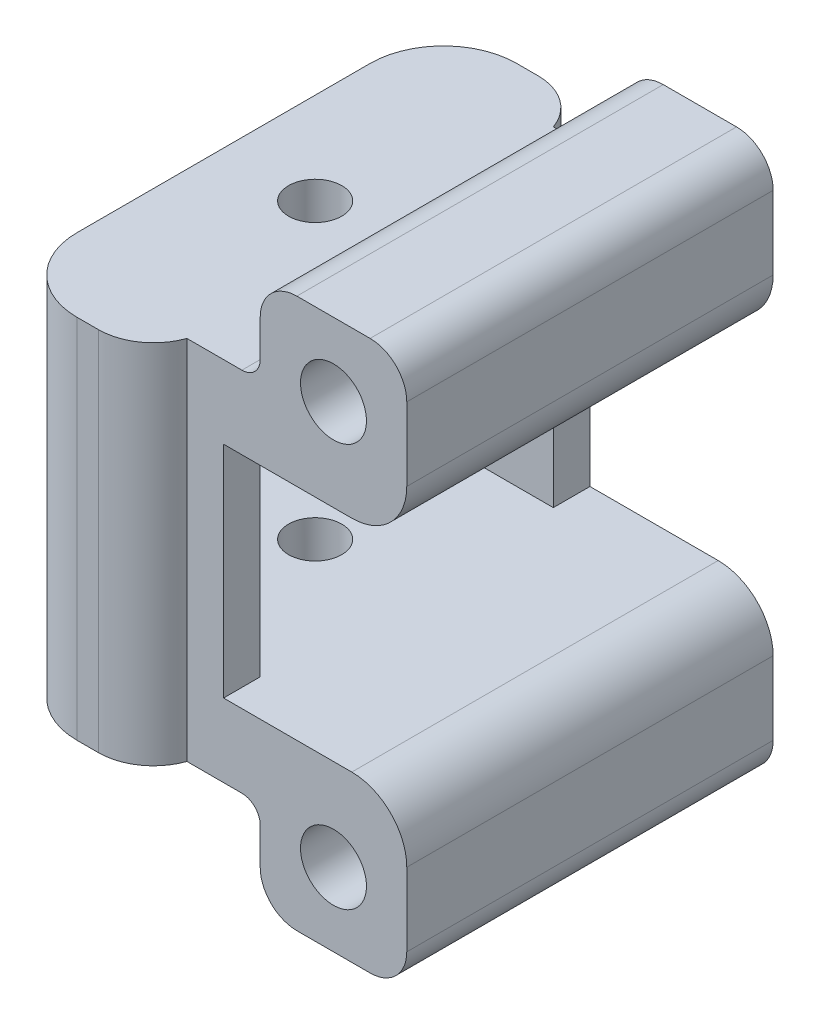
ISO-10303-21;
HEADER;
FILE_DESCRIPTION(('STEP AP214'),'2;1');
FILE_NAME('part.step','',(''),(''),'','','');
FILE_SCHEMA(('AUTOMOTIVE_DESIGN { 1 0 10303 214 1 1 1 1 }'));
ENDSEC;
DATA;
#1=APPLICATION_CONTEXT('core data for automotive mechanical design processes');
#2=APPLICATION_PROTOCOL_DEFINITION('international standard','automotive_design',2000,#1);
#3=PRODUCT_CONTEXT('',#1,'mechanical');
#4=PRODUCT('Part','Part','',(#3));
#5=PRODUCT_RELATED_PRODUCT_CATEGORY('part','',(#4));
#6=PRODUCT_DEFINITION_FORMATION('','',#4);
#7=PRODUCT_DEFINITION_CONTEXT('part definition',#1,'design');
#8=PRODUCT_DEFINITION('design','',#6,#7);
#9=PRODUCT_DEFINITION_SHAPE('','',#8);
#10=(LENGTH_UNIT() NAMED_UNIT(*) SI_UNIT(.MILLI.,.METRE.));
#11=(NAMED_UNIT(*) PLANE_ANGLE_UNIT() SI_UNIT($,.RADIAN.));
#12=(NAMED_UNIT(*) SI_UNIT($,.STERADIAN.) SOLID_ANGLE_UNIT());
#13=UNCERTAINTY_MEASURE_WITH_UNIT(LENGTH_MEASURE(1.E-05),#10,'distance_accuracy_value','');
#14=(GEOMETRIC_REPRESENTATION_CONTEXT(3) GLOBAL_UNCERTAINTY_ASSIGNED_CONTEXT((#13)) GLOBAL_UNIT_ASSIGNED_CONTEXT((#10,
#11,#12)) REPRESENTATION_CONTEXT('',''));
#15=CARTESIAN_POINT('',(0.,0.,0.));
#16=DIRECTION('',(0.,0.,1.));
#17=DIRECTION('',(1.,0.,0.));
#18=AXIS2_PLACEMENT_3D('',#15,#16,#17);
#19=CARTESIAN_POINT('',(6.,0.,0.));
#20=DIRECTION('',(1.,0.,0.));
#21=DIRECTION('',(0.,0.,-1.));
#22=AXIS2_PLACEMENT_3D('',#19,#20,#21);
#23=PLANE('',#22);
#24=DIRECTION('',(0.,0.,1.));
#25=VECTOR('',#24,1.);
#26=CARTESIAN_POINT('',(6.,0.,0.));
#27=LINE('',#26,#25);
#28=CARTESIAN_POINT('',(6.,0.,2.));
#29=VERTEX_POINT('',#28);
#30=CARTESIAN_POINT('',(6.,0.,18.));
#31=VERTEX_POINT('',#30);
#32=EDGE_CURVE('E235',#29,#31,#27,.T.);
#33=ORIENTED_EDGE('',*,*,#32,.F.);
#34=DIRECTION('',(0.,1.,0.));
#35=VECTOR('',#34,1.);
#36=CARTESIAN_POINT('',(6.,-20.,2.));
#37=LINE('',#36,#35);
#38=CARTESIAN_POINT('',(6.,-4.00000000000002,2.));
#39=VERTEX_POINT('',#38);
#40=EDGE_CURVE('E230',#29,#39,#37,.F.);
#41=ORIENTED_EDGE('',*,*,#40,.T.);
#42=DIRECTION('',(0.,0.,-1.));
#43=VECTOR('',#42,1.);
#44=CARTESIAN_POINT('',(6.,-4.,0.));
#45=LINE('',#44,#43);
#46=CARTESIAN_POINT('',(6.,-4.00000000000001,18.));
#47=VERTEX_POINT('',#46);
#48=EDGE_CURVE('E232',#47,#39,#45,.T.);
#49=ORIENTED_EDGE('',*,*,#48,.F.);
#50=DIRECTION('',(0.,-1.,0.));
#51=VECTOR('',#50,1.);
#52=CARTESIAN_POINT('',(6.,0.,18.));
#53=LINE('',#52,#51);
#54=EDGE_CURVE('E453',#47,#31,#53,.F.);
#55=ORIENTED_EDGE('',*,*,#54,.T.);
#56=EDGE_LOOP('',(#33,#41,#49,#55));
#57=FACE_BOUND('',#56,.T.);
#58=ADVANCED_FACE('F35',(#57),#23,.F.);
#59=CARTESIAN_POINT('',(4.,0.,0.));
#60=DIRECTION('',(0.,0.,1.));
#61=DIRECTION('',(0.,-1.,0.));
#62=AXIS2_PLACEMENT_3D('',#59,#60,#61);
#63=PLANE('',#62);
#64=CARTESIAN_POINT('',(22.,1.,0.));
#65=DIRECTION('',(0.,0.,-1.));
#66=DIRECTION('',(0.,1.,0.));
#67=AXIS2_PLACEMENT_3D('',#64,#65,#66);
#68=CIRCLE('',#67,1.8);
#69=CARTESIAN_POINT('',(22.,2.8,0.));
#70=VERTEX_POINT('',#69);
#71=EDGE_CURVE('E316',#70,#70,#68,.T.);
#72=ORIENTED_EDGE('',*,*,#71,.F.);
#73=EDGE_LOOP('',(#72));
#74=FACE_BOUND('',#73,.T.);
#75=CARTESIAN_POINT('',(21.9999999999991,-21.,0.));
#76=DIRECTION('',(0.,0.,-1.));
#77=DIRECTION('',(0.,1.,0.));
#78=AXIS2_PLACEMENT_3D('',#75,#76,#77);
#79=CIRCLE('',#78,1.8);
#80=CARTESIAN_POINT('',(21.9999999999991,-19.2,0.));
#81=VERTEX_POINT('',#80);
#82=EDGE_CURVE('E312',#81,#81,#79,.T.);
#83=ORIENTED_EDGE('',*,*,#82,.F.);
#84=EDGE_LOOP('',(#83));
#85=FACE_BOUND('',#84,.T.);
#86=DIRECTION('',(1.,0.,0.));
#87=VECTOR('',#86,1.);
#88=CARTESIAN_POINT('',(26.,-25.,0.));
#89=LINE('',#88,#87);
#90=CARTESIAN_POINT('',(20.,-25.,0.));
#91=VERTEX_POINT('',#90);
#92=CARTESIAN_POINT('',(24.,-25.,0.));
#93=VERTEX_POINT('',#92);
#94=EDGE_CURVE('E338',#91,#93,#89,.T.);
#95=ORIENTED_EDGE('',*,*,#94,.F.);
#96=CARTESIAN_POINT('',(20.,-23.,0.));
#97=DIRECTION('',(0.,0.,1.));
#98=DIRECTION('',(0.,-1.,0.));
#99=AXIS2_PLACEMENT_3D('',#96,#97,#98);
#100=CIRCLE('',#99,2.);
#101=CARTESIAN_POINT('',(18.,-23.,0.));
#102=VERTEX_POINT('',#101);
#103=EDGE_CURVE('E421',#91,#102,#100,.F.);
#104=ORIENTED_EDGE('',*,*,#103,.T.);
#105=DIRECTION('',(0.,1.,0.));
#106=VECTOR('',#105,1.);
#107=CARTESIAN_POINT('',(18.,-25.,0.));
#108=LINE('',#107,#106);
#109=CARTESIAN_POINT('',(18.,-21.,0.));
#110=VERTEX_POINT('',#109);
#111=EDGE_CURVE('E341',#102,#110,#108,.T.);
#112=ORIENTED_EDGE('',*,*,#111,.T.);
#113=CARTESIAN_POINT('',(17.,-21.,0.));
#114=DIRECTION('',(0.,0.,1.));
#115=DIRECTION('',(0.,-1.,0.));
#116=AXIS2_PLACEMENT_3D('',#113,#114,#115);
#117=CIRCLE('',#116,1.);
#118=CARTESIAN_POINT('',(17.,-20.,0.));
#119=VERTEX_POINT('',#118);
#120=EDGE_CURVE('E486',#110,#119,#117,.T.);
#121=ORIENTED_EDGE('',*,*,#120,.T.);
#122=DIRECTION('',(-1.,0.,0.));
#123=VECTOR('',#122,1.);
#124=CARTESIAN_POINT('',(4.,-20.,0.));
#125=LINE('',#124,#123);
#126=CARTESIAN_POINT('',(14.,-20.,0.));
#127=VERTEX_POINT('',#126);
#128=EDGE_CURVE('E377',#119,#127,#125,.T.);
#129=ORIENTED_EDGE('',*,*,#128,.T.);
#130=DIRECTION('',(0.,-1.,0.));
#131=VECTOR('',#130,1.);
#132=CARTESIAN_POINT('',(14.,-20.,0.));
#133=LINE('',#132,#131);
#134=CARTESIAN_POINT('',(14.,0.,0.));
#135=VERTEX_POINT('',#134);
#136=EDGE_CURVE('E280',#135,#127,#133,.T.);
#137=ORIENTED_EDGE('',*,*,#136,.F.);
#138=DIRECTION('',(-1.,0.,0.));
#139=VECTOR('',#138,1.);
#140=CARTESIAN_POINT('',(4.,0.,0.));
#141=LINE('',#140,#139);
#142=CARTESIAN_POINT('',(17.,0.,0.));
#143=VERTEX_POINT('',#142);
#144=EDGE_CURVE('E383',#143,#135,#141,.T.);
#145=ORIENTED_EDGE('',*,*,#144,.F.);
#146=CARTESIAN_POINT('',(17.,1.,0.));
#147=DIRECTION('',(0.,0.,1.));
#148=DIRECTION('',(0.,-1.,0.));
#149=AXIS2_PLACEMENT_3D('',#146,#147,#148);
#150=CIRCLE('',#149,1.);
#151=CARTESIAN_POINT('',(18.,1.,0.));
#152=VERTEX_POINT('',#151);
#153=EDGE_CURVE('E11',#143,#152,#150,.T.);
#154=ORIENTED_EDGE('',*,*,#153,.T.);
#155=DIRECTION('',(0.,-1.,0.));
#156=VECTOR('',#155,1.);
#157=CARTESIAN_POINT('',(18.,5.,0.));
#158=LINE('',#157,#156);
#159=CARTESIAN_POINT('',(18.,3.,0.));
#160=VERTEX_POINT('',#159);
#161=EDGE_CURVE('E332',#160,#152,#158,.T.);
#162=ORIENTED_EDGE('',*,*,#161,.F.);
#163=CARTESIAN_POINT('',(20.,3.,0.));
#164=DIRECTION('',(0.,0.,1.));
#165=DIRECTION('',(0.,-1.,0.));
#166=AXIS2_PLACEMENT_3D('',#163,#164,#165);
#167=CIRCLE('',#166,2.);
#168=CARTESIAN_POINT('',(20.,5.,0.));
#169=VERTEX_POINT('',#168);
#170=EDGE_CURVE('E417',#160,#169,#167,.F.);
#171=ORIENTED_EDGE('',*,*,#170,.T.);
#172=DIRECTION('',(-1.,0.,0.));
#173=VECTOR('',#172,1.);
#174=CARTESIAN_POINT('',(26.,5.,0.));
#175=LINE('',#174,#173);
#176=CARTESIAN_POINT('',(24.,5.,0.));
#177=VERTEX_POINT('',#176);
#178=EDGE_CURVE('E322',#177,#169,#175,.T.);
#179=ORIENTED_EDGE('',*,*,#178,.F.);
#180=CARTESIAN_POINT('',(24.,3.,0.));
#181=DIRECTION('',(0.,0.,1.));
#182=DIRECTION('',(0.,-1.,0.));
#183=AXIS2_PLACEMENT_3D('',#180,#181,#182);
#184=CIRCLE('',#183,2.);
#185=CARTESIAN_POINT('',(26.,3.,0.));
#186=VERTEX_POINT('',#185);
#187=EDGE_CURVE('E415',#177,#186,#184,.F.);
#188=ORIENTED_EDGE('',*,*,#187,.T.);
#189=DIRECTION('',(0.,1.,0.));
#190=VECTOR('',#189,1.);
#191=CARTESIAN_POINT('',(26.,0.,0.));
#192=LINE('',#191,#190);
#193=CARTESIAN_POINT('',(26.,-1.,0.));
#194=VERTEX_POINT('',#193);
#195=EDGE_CURVE('E348',#194,#186,#192,.T.);
#196=ORIENTED_EDGE('',*,*,#195,.F.);
#197=CARTESIAN_POINT('',(23.,-1.,0.));
#198=DIRECTION('',(0.,0.,1.));
#199=DIRECTION('',(0.,-1.,0.));
#200=AXIS2_PLACEMENT_3D('',#197,#198,#199);
#201=CIRCLE('',#200,3.);
#202=CARTESIAN_POINT('',(23.,-4.,0.));
#203=VERTEX_POINT('',#202);
#204=EDGE_CURVE('E399',#194,#203,#201,.F.);
#205=ORIENTED_EDGE('',*,*,#204,.T.);
#206=DIRECTION('',(-1.,0.,0.));
#207=VECTOR('',#206,1.);
#208=CARTESIAN_POINT('',(26.,-4.,0.));
#209=LINE('',#208,#207);
#210=CARTESIAN_POINT('',(16.,-4.,0.));
#211=VERTEX_POINT('',#210);
#212=EDGE_CURVE('E353',#203,#211,#209,.T.);
#213=ORIENTED_EDGE('',*,*,#212,.T.);
#214=DIRECTION('',(0.,1.,0.));
#215=VECTOR('',#214,1.);
#216=CARTESIAN_POINT('',(16.,0.,0.));
#217=LINE('',#216,#215);
#218=CARTESIAN_POINT('',(16.,-16.,0.));
#219=VERTEX_POINT('',#218);
#220=EDGE_CURVE('E371',#219,#211,#217,.T.);
#221=ORIENTED_EDGE('',*,*,#220,.F.);
#222=DIRECTION('',(-1.,0.,0.));
#223=VECTOR('',#222,1.);
#224=CARTESIAN_POINT('',(26.,-16.,0.));
#225=LINE('',#224,#223);
#226=CARTESIAN_POINT('',(23.,-16.,0.));
#227=VERTEX_POINT('',#226);
#228=EDGE_CURVE('E369',#227,#219,#225,.T.);
#229=ORIENTED_EDGE('',*,*,#228,.F.);
#230=CARTESIAN_POINT('',(23.,-19.,0.));
#231=DIRECTION('',(0.,0.,1.));
#232=DIRECTION('',(0.,-1.,0.));
#233=AXIS2_PLACEMENT_3D('',#230,#231,#232);
#234=CIRCLE('',#233,3.);
#235=CARTESIAN_POINT('',(26.,-19.,0.));
#236=VERTEX_POINT('',#235);
#237=EDGE_CURVE('E401',#227,#236,#234,.F.);
#238=ORIENTED_EDGE('',*,*,#237,.T.);
#239=DIRECTION('',(0.,1.,0.));
#240=VECTOR('',#239,1.);
#241=CARTESIAN_POINT('',(26.,-20.,0.));
#242=LINE('',#241,#240);
#243=CARTESIAN_POINT('',(26.,-23.,0.));
#244=VERTEX_POINT('',#243);
#245=EDGE_CURVE('E359',#244,#236,#242,.T.);
#246=ORIENTED_EDGE('',*,*,#245,.F.);
#247=CARTESIAN_POINT('',(24.,-23.,0.));
#248=DIRECTION('',(0.,0.,1.));
#249=DIRECTION('',(0.,-1.,0.));
#250=AXIS2_PLACEMENT_3D('',#247,#248,#249);
#251=CIRCLE('',#250,2.);
#252=EDGE_CURVE('E419',#244,#93,#251,.F.);
#253=ORIENTED_EDGE('',*,*,#252,.T.);
#254=EDGE_LOOP('',(#95,#104,#112,#121,#129,#137,#145,#154,#162,#171,#179,#188,#196,#205,#213,
#221,#229,#238,#246,#253));
#255=FACE_BOUND('',#254,.T.);
#256=ADVANCED_FACE('F514',(#74,#85,#255),#63,.F.);
#257=CARTESIAN_POINT('',(4.,0.,20.));
#258=DIRECTION('',(0.,0.,-1.));
#259=DIRECTION('',(-1.,0.,0.));
#260=AXIS2_PLACEMENT_3D('',#257,#258,#259);
#261=PLANE('',#260);
#262=CARTESIAN_POINT('',(22.,1.,20.));
#263=DIRECTION('',(0.,0.,-1.));
#264=DIRECTION('',(0.,1.,0.));
#265=AXIS2_PLACEMENT_3D('',#262,#263,#264);
#266=CIRCLE('',#265,1.8);
#267=CARTESIAN_POINT('',(22.,2.8,20.));
#268=VERTEX_POINT('',#267);
#269=EDGE_CURVE('E319',#268,#268,#266,.T.);
#270=ORIENTED_EDGE('',*,*,#269,.T.);
#271=EDGE_LOOP('',(#270));
#272=FACE_BOUND('',#271,.T.);
#273=CARTESIAN_POINT('',(21.9999999999991,-21.,20.));
#274=DIRECTION('',(0.,0.,-1.));
#275=DIRECTION('',(0.,1.,0.));
#276=AXIS2_PLACEMENT_3D('',#273,#274,#275);
#277=CIRCLE('',#276,1.8);
#278=CARTESIAN_POINT('',(21.9999999999991,-19.2,20.));
#279=VERTEX_POINT('',#278);
#280=EDGE_CURVE('E313',#279,#279,#277,.T.);
#281=ORIENTED_EDGE('',*,*,#280,.T.);
#282=EDGE_LOOP('',(#281));
#283=FACE_BOUND('',#282,.T.);
#284=DIRECTION('',(0.,1.,0.));
#285=VECTOR('',#284,1.);
#286=CARTESIAN_POINT('',(18.,-25.,20.));
#287=LINE('',#286,#285);
#288=CARTESIAN_POINT('',(18.,-23.,20.));
#289=VERTEX_POINT('',#288);
#290=CARTESIAN_POINT('',(18.,-21.,20.));
#291=VERTEX_POINT('',#290);
#292=EDGE_CURVE('E344',#289,#291,#287,.T.);
#293=ORIENTED_EDGE('',*,*,#292,.F.);
#294=CARTESIAN_POINT('',(20.,-23.,20.));
#295=DIRECTION('',(0.,0.,-1.));
#296=DIRECTION('',(-1.,0.,0.));
#297=AXIS2_PLACEMENT_3D('',#294,#295,#296);
#298=CIRCLE('',#297,2.);
#299=CARTESIAN_POINT('',(20.,-25.,20.));
#300=VERTEX_POINT('',#299);
#301=EDGE_CURVE('E431',#289,#300,#298,.F.);
#302=ORIENTED_EDGE('',*,*,#301,.T.);
#303=DIRECTION('',(-1.,0.,0.));
#304=VECTOR('',#303,1.);
#305=CARTESIAN_POINT('',(26.,-25.,20.));
#306=LINE('',#305,#304);
#307=CARTESIAN_POINT('',(24.,-25.,20.));
#308=VERTEX_POINT('',#307);
#309=EDGE_CURVE('E335',#308,#300,#306,.T.);
#310=ORIENTED_EDGE('',*,*,#309,.F.);
#311=CARTESIAN_POINT('',(24.,-23.,20.));
#312=DIRECTION('',(0.,0.,-1.));
#313=DIRECTION('',(-1.,0.,0.));
#314=AXIS2_PLACEMENT_3D('',#311,#312,#313);
#315=CIRCLE('',#314,2.);
#316=CARTESIAN_POINT('',(26.,-23.,20.));
#317=VERTEX_POINT('',#316);
#318=EDGE_CURVE('E429',#308,#317,#315,.F.);
#319=ORIENTED_EDGE('',*,*,#318,.T.);
#320=DIRECTION('',(0.,-1.,0.));
#321=VECTOR('',#320,1.);
#322=CARTESIAN_POINT('',(26.,-20.,20.));
#323=LINE('',#322,#321);
#324=CARTESIAN_POINT('',(26.,-19.,20.));
#325=VERTEX_POINT('',#324);
#326=EDGE_CURVE('E361',#325,#317,#323,.T.);
#327=ORIENTED_EDGE('',*,*,#326,.F.);
#328=CARTESIAN_POINT('',(23.,-19.,20.));
#329=DIRECTION('',(0.,0.,-1.));
#330=DIRECTION('',(-1.,0.,0.));
#331=AXIS2_PLACEMENT_3D('',#328,#329,#330);
#332=CIRCLE('',#331,3.);
#333=CARTESIAN_POINT('',(23.,-16.,20.));
#334=VERTEX_POINT('',#333);
#335=EDGE_CURVE('E395',#325,#334,#332,.F.);
#336=ORIENTED_EDGE('',*,*,#335,.T.);
#337=DIRECTION('',(-1.,0.,0.));
#338=VECTOR('',#337,1.);
#339=CARTESIAN_POINT('',(26.,-16.,20.));
#340=LINE('',#339,#338);
#341=CARTESIAN_POINT('',(16.,-16.,20.));
#342=VERTEX_POINT('',#341);
#343=EDGE_CURVE('E364',#334,#342,#340,.T.);
#344=ORIENTED_EDGE('',*,*,#343,.T.);
#345=DIRECTION('',(0.,-1.,0.));
#346=VECTOR('',#345,1.);
#347=CARTESIAN_POINT('',(16.,0.,20.));
#348=LINE('',#347,#346);
#349=CARTESIAN_POINT('',(16.,-4.,20.));
#350=VERTEX_POINT('',#349);
#351=EDGE_CURVE('E374',#350,#342,#348,.T.);
#352=ORIENTED_EDGE('',*,*,#351,.F.);
#353=DIRECTION('',(-1.,0.,0.));
#354=VECTOR('',#353,1.);
#355=CARTESIAN_POINT('',(26.,-4.,20.));
#356=LINE('',#355,#354);
#357=CARTESIAN_POINT('',(23.,-4.,20.));
#358=VERTEX_POINT('',#357);
#359=EDGE_CURVE('E356',#358,#350,#356,.T.);
#360=ORIENTED_EDGE('',*,*,#359,.F.);
#361=CARTESIAN_POINT('',(23.,-1.,20.));
#362=DIRECTION('',(0.,0.,-1.));
#363=DIRECTION('',(-1.,0.,0.));
#364=AXIS2_PLACEMENT_3D('',#361,#362,#363);
#365=CIRCLE('',#364,3.);
#366=CARTESIAN_POINT('',(26.,-1.,20.));
#367=VERTEX_POINT('',#366);
#368=EDGE_CURVE('E392',#358,#367,#365,.F.);
#369=ORIENTED_EDGE('',*,*,#368,.T.);
#370=DIRECTION('',(0.,-1.,0.));
#371=VECTOR('',#370,1.);
#372=CARTESIAN_POINT('',(26.,0.,20.));
#373=LINE('',#372,#371);
#374=CARTESIAN_POINT('',(26.,3.,20.));
#375=VERTEX_POINT('',#374);
#376=EDGE_CURVE('E351',#375,#367,#373,.T.);
#377=ORIENTED_EDGE('',*,*,#376,.F.);
#378=CARTESIAN_POINT('',(24.,3.,20.));
#379=DIRECTION('',(0.,0.,-1.));
#380=DIRECTION('',(-1.,0.,0.));
#381=AXIS2_PLACEMENT_3D('',#378,#379,#380);
#382=CIRCLE('',#381,2.);
#383=CARTESIAN_POINT('',(24.,5.,20.));
#384=VERTEX_POINT('',#383);
#385=EDGE_CURVE('E425',#375,#384,#382,.F.);
#386=ORIENTED_EDGE('',*,*,#385,.T.);
#387=DIRECTION('',(1.,0.,0.));
#388=VECTOR('',#387,1.);
#389=CARTESIAN_POINT('',(26.,5.,20.));
#390=LINE('',#389,#388);
#391=CARTESIAN_POINT('',(20.,5.,20.));
#392=VERTEX_POINT('',#391);
#393=EDGE_CURVE('E327',#392,#384,#390,.T.);
#394=ORIENTED_EDGE('',*,*,#393,.F.);
#395=CARTESIAN_POINT('',(20.,3.,20.));
#396=DIRECTION('',(0.,0.,-1.));
#397=DIRECTION('',(-1.,0.,0.));
#398=AXIS2_PLACEMENT_3D('',#395,#396,#397);
#399=CIRCLE('',#398,2.);
#400=CARTESIAN_POINT('',(18.,3.,20.));
#401=VERTEX_POINT('',#400);
#402=EDGE_CURVE('E427',#392,#401,#399,.F.);
#403=ORIENTED_EDGE('',*,*,#402,.T.);
#404=DIRECTION('',(0.,-1.,0.));
#405=VECTOR('',#404,1.);
#406=CARTESIAN_POINT('',(18.,5.,20.));
#407=LINE('',#406,#405);
#408=CARTESIAN_POINT('',(18.,0.999999999999997,20.));
#409=VERTEX_POINT('',#408);
#410=EDGE_CURVE('E330',#401,#409,#407,.T.);
#411=ORIENTED_EDGE('',*,*,#410,.T.);
#412=CARTESIAN_POINT('',(17.,0.999999999999996,20.));
#413=DIRECTION('',(0.,0.,-1.));
#414=DIRECTION('',(-1.,0.,0.));
#415=AXIS2_PLACEMENT_3D('',#412,#413,#414);
#416=CIRCLE('',#415,1.);
#417=CARTESIAN_POINT('',(17.,0.,20.));
#418=VERTEX_POINT('',#417);
#419=EDGE_CURVE('E43',#409,#418,#416,.T.);
#420=ORIENTED_EDGE('',*,*,#419,.T.);
#421=DIRECTION('',(-1.,0.,0.));
#422=VECTOR('',#421,1.);
#423=CARTESIAN_POINT('',(4.,0.,20.));
#424=LINE('',#423,#422);
#425=CARTESIAN_POINT('',(14.,0.,20.));
#426=VERTEX_POINT('',#425);
#427=EDGE_CURVE('E381',#418,#426,#424,.T.);
#428=ORIENTED_EDGE('',*,*,#427,.T.);
#429=DIRECTION('',(0.,1.,0.));
#430=VECTOR('',#429,1.);
#431=CARTESIAN_POINT('',(14.,-20.,20.));
#432=LINE('',#431,#430);
#433=CARTESIAN_POINT('',(14.,-20.,20.));
#434=VERTEX_POINT('',#433);
#435=EDGE_CURVE('E286',#434,#426,#432,.T.);
#436=ORIENTED_EDGE('',*,*,#435,.F.);
#437=DIRECTION('',(-1.,0.,0.));
#438=VECTOR('',#437,1.);
#439=CARTESIAN_POINT('',(4.,-20.,20.));
#440=LINE('',#439,#438);
#441=CARTESIAN_POINT('',(17.,-20.,20.));
#442=VERTEX_POINT('',#441);
#443=EDGE_CURVE('E379',#442,#434,#440,.T.);
#444=ORIENTED_EDGE('',*,*,#443,.F.);
#445=CARTESIAN_POINT('',(17.,-21.,20.));
#446=DIRECTION('',(0.,0.,-1.));
#447=DIRECTION('',(-1.,0.,0.));
#448=AXIS2_PLACEMENT_3D('',#445,#446,#447);
#449=CIRCLE('',#448,1.);
#450=EDGE_CURVE('E488',#442,#291,#449,.T.);
#451=ORIENTED_EDGE('',*,*,#450,.T.);
#452=EDGE_LOOP('',(#293,#302,#310,#319,#327,#336,#344,#352,#360,#369,#377,#386,#394,#403,#411,
#420,#428,#436,#444,#451));
#453=FACE_BOUND('',#452,.T.);
#454=ADVANCED_FACE('F502',(#272,#283,#453),#261,.F.);
#455=CARTESIAN_POINT('',(4.,0.,0.));
#456=DIRECTION('',(0.,-1.,0.));
#457=DIRECTION('',(0.,0.,-1.));
#458=AXIS2_PLACEMENT_3D('',#455,#456,#457);
#459=PLANE('',#458);
#460=CARTESIAN_POINT('',(11.,0.,10.));
#461=DIRECTION('',(0.,1.,0.));
#462=DIRECTION('',(0.,0.,1.));
#463=AXIS2_PLACEMENT_3D('',#460,#461,#462);
#464=CIRCLE('',#463,1.45);
#465=CARTESIAN_POINT('',(11.,0.,11.45));
#466=VERTEX_POINT('',#465);
#467=EDGE_CURVE('E294',#466,#466,#464,.T.);
#468=ORIENTED_EDGE('',*,*,#467,.F.);
#469=EDGE_LOOP('',(#468));
#470=FACE_BOUND('',#469,.T.);
#471=ORIENTED_EDGE('',*,*,#427,.F.);
#472=DIRECTION('',(0.,0.,1.));
#473=VECTOR('',#472,1.);
#474=CARTESIAN_POINT('',(17.,0.,0.));
#475=LINE('',#474,#473);
#476=EDGE_CURVE('E56',#418,#143,#475,.F.);
#477=ORIENTED_EDGE('',*,*,#476,.T.);
#478=ORIENTED_EDGE('',*,*,#144,.T.);
#479=CARTESIAN_POINT('',(11.1715728752538,0.,1.));
#480=DIRECTION('',(0.,-1.,0.));
#481=DIRECTION('',(0.,0.,-1.));
#482=AXIS2_PLACEMENT_3D('',#479,#480,#481);
#483=CIRCLE('',#482,3.);
#484=CARTESIAN_POINT('',(11.1715728752538,0.,-2.));
#485=VERTEX_POINT('',#484);
#486=EDGE_CURVE('E476',#135,#485,#483,.F.);
#487=ORIENTED_EDGE('',*,*,#486,.T.);
#488=DIRECTION('',(1.,0.,0.));
#489=VECTOR('',#488,1.);
#490=CARTESIAN_POINT('',(6.,0.,-2.));
#491=LINE('',#490,#489);
#492=CARTESIAN_POINT('',(10.,0.,-2.));
#493=VERTEX_POINT('',#492);
#494=EDGE_CURVE('E281',#493,#485,#491,.T.);
#495=ORIENTED_EDGE('',*,*,#494,.F.);
#496=CARTESIAN_POINT('',(10.,0.,2.));
#497=DIRECTION('',(0.,-1.,0.));
#498=DIRECTION('',(0.,0.,-1.));
#499=AXIS2_PLACEMENT_3D('',#496,#497,#498);
#500=CIRCLE('',#499,4.);
#501=EDGE_CURVE('E451',#493,#29,#500,.F.);
#502=ORIENTED_EDGE('',*,*,#501,.T.);
#503=ORIENTED_EDGE('',*,*,#32,.T.);
#504=CARTESIAN_POINT('',(10.,0.,18.));
#505=DIRECTION('',(0.,-1.,0.));
#506=DIRECTION('',(0.,0.,-1.));
#507=AXIS2_PLACEMENT_3D('',#504,#505,#506);
#508=CIRCLE('',#507,4.);
#509=CARTESIAN_POINT('',(10.,0.,22.));
#510=VERTEX_POINT('',#509);
#511=EDGE_CURVE('E448',#31,#510,#508,.F.);
#512=ORIENTED_EDGE('',*,*,#511,.T.);
#513=DIRECTION('',(-1.,0.,0.));
#514=VECTOR('',#513,1.);
#515=CARTESIAN_POINT('',(6.,0.,22.));
#516=LINE('',#515,#514);
#517=CARTESIAN_POINT('',(11.1715728752538,0.,22.));
#518=VERTEX_POINT('',#517);
#519=EDGE_CURVE('E292',#518,#510,#516,.T.);
#520=ORIENTED_EDGE('',*,*,#519,.F.);
#521=CARTESIAN_POINT('',(11.1715728752538,0.,19.));
#522=DIRECTION('',(0.,-1.,0.));
#523=DIRECTION('',(0.,0.,-1.));
#524=AXIS2_PLACEMENT_3D('',#521,#522,#523);
#525=CIRCLE('',#524,3.);
#526=EDGE_CURVE('E473',#518,#426,#525,.F.);
#527=ORIENTED_EDGE('',*,*,#526,.T.);
#528=EDGE_LOOP('',(#471,#477,#478,#487,#495,#502,#503,#512,#520,#527));
#529=FACE_BOUND('',#528,.T.);
#530=ADVANCED_FACE('F613',(#470,#529),#459,.F.);
#531=CARTESIAN_POINT('',(4.,-20.,0.));
#532=DIRECTION('',(0.,1.,0.));
#533=DIRECTION('',(0.,0.,1.));
#534=AXIS2_PLACEMENT_3D('',#531,#532,#533);
#535=PLANE('',#534);
#536=CARTESIAN_POINT('',(11.,-20.,10.));
#537=DIRECTION('',(0.,1.,0.));
#538=DIRECTION('',(0.,0.,1.));
#539=AXIS2_PLACEMENT_3D('',#536,#537,#538);
#540=CIRCLE('',#539,1.45);
#541=CARTESIAN_POINT('',(11.,-20.,11.45));
#542=VERTEX_POINT('',#541);
#543=EDGE_CURVE('E303',#542,#542,#540,.T.);
#544=ORIENTED_EDGE('',*,*,#543,.T.);
#545=EDGE_LOOP('',(#544));
#546=FACE_BOUND('',#545,.T.);
#547=ORIENTED_EDGE('',*,*,#128,.F.);
#548=DIRECTION('',(0.,0.,-1.));
#549=VECTOR('',#548,1.);
#550=CARTESIAN_POINT('',(17.,-20.,20.));
#551=LINE('',#550,#549);
#552=EDGE_CURVE('E484',#119,#442,#551,.F.);
#553=ORIENTED_EDGE('',*,*,#552,.T.);
#554=ORIENTED_EDGE('',*,*,#443,.T.);
#555=CARTESIAN_POINT('',(11.1715728752538,-20.,19.));
#556=DIRECTION('',(0.,1.,0.));
#557=DIRECTION('',(0.,0.,1.));
#558=AXIS2_PLACEMENT_3D('',#555,#556,#557);
#559=CIRCLE('',#558,3.);
#560=CARTESIAN_POINT('',(11.1715728752538,-20.,22.));
#561=VERTEX_POINT('',#560);
#562=EDGE_CURVE('E468',#434,#561,#559,.F.);
#563=ORIENTED_EDGE('',*,*,#562,.T.);
#564=DIRECTION('',(1.,0.,0.));
#565=VECTOR('',#564,1.);
#566=CARTESIAN_POINT('',(6.,-20.,22.));
#567=LINE('',#566,#565);
#568=CARTESIAN_POINT('',(10.,-20.,22.));
#569=VERTEX_POINT('',#568);
#570=EDGE_CURVE('E289',#569,#561,#567,.T.);
#571=ORIENTED_EDGE('',*,*,#570,.F.);
#572=CARTESIAN_POINT('',(10.,-20.,18.));
#573=DIRECTION('',(0.,1.,0.));
#574=DIRECTION('',(0.,0.,1.));
#575=AXIS2_PLACEMENT_3D('',#572,#573,#574);
#576=CIRCLE('',#575,4.);
#577=CARTESIAN_POINT('',(6.,-20.,18.));
#578=VERTEX_POINT('',#577);
#579=EDGE_CURVE('E238',#569,#578,#576,.F.);
#580=ORIENTED_EDGE('',*,*,#579,.T.);
#581=DIRECTION('',(0.,0.,1.));
#582=VECTOR('',#581,1.);
#583=CARTESIAN_POINT('',(6.,-20.,0.));
#584=LINE('',#583,#582);
#585=CARTESIAN_POINT('',(6.,-20.,2.));
#586=VERTEX_POINT('',#585);
#587=EDGE_CURVE('E306',#586,#578,#584,.T.);
#588=ORIENTED_EDGE('',*,*,#587,.F.);
#589=CARTESIAN_POINT('',(10.,-20.,2.));
#590=DIRECTION('',(0.,1.,0.));
#591=DIRECTION('',(0.,0.,1.));
#592=AXIS2_PLACEMENT_3D('',#589,#590,#591);
#593=CIRCLE('',#592,4.);
#594=CARTESIAN_POINT('',(10.,-20.,-2.));
#595=VERTEX_POINT('',#594);
#596=EDGE_CURVE('E459',#586,#595,#593,.F.);
#597=ORIENTED_EDGE('',*,*,#596,.T.);
#598=DIRECTION('',(-1.,0.,0.));
#599=VECTOR('',#598,1.);
#600=CARTESIAN_POINT('',(6.,-20.,-2.));
#601=LINE('',#600,#599);
#602=CARTESIAN_POINT('',(11.1715728752538,-20.,-2.));
#603=VERTEX_POINT('',#602);
#604=EDGE_CURVE('E284',#603,#595,#601,.T.);
#605=ORIENTED_EDGE('',*,*,#604,.F.);
#606=CARTESIAN_POINT('',(11.1715728752538,-20.,1.));
#607=DIRECTION('',(0.,1.,0.));
#608=DIRECTION('',(0.,0.,1.));
#609=AXIS2_PLACEMENT_3D('',#606,#607,#608);
#610=CIRCLE('',#609,3.);
#611=EDGE_CURVE('E470',#603,#127,#610,.F.);
#612=ORIENTED_EDGE('',*,*,#611,.T.);
#613=EDGE_LOOP('',(#547,#553,#554,#563,#571,#580,#588,#597,#605,#612));
#614=FACE_BOUND('',#613,.T.);
#615=ADVANCED_FACE('F605',(#546,#614),#535,.F.);
#616=CARTESIAN_POINT('',(16.,0.,0.));
#617=DIRECTION('',(1.,0.,0.));
#618=DIRECTION('',(0.,0.,-1.));
#619=AXIS2_PLACEMENT_3D('',#616,#617,#618);
#620=PLANE('',#619);
#621=DIRECTION('',(0.,1.,0.));
#622=VECTOR('',#621,1.);
#623=CARTESIAN_POINT('',(16.,0.,2.));
#624=LINE('',#623,#622);
#625=CARTESIAN_POINT('',(16.,-16.,2.));
#626=VERTEX_POINT('',#625);
#627=CARTESIAN_POINT('',(16.,-4.00000000000002,2.));
#628=VERTEX_POINT('',#627);
#629=EDGE_CURVE('E262',#626,#628,#624,.T.);
#630=ORIENTED_EDGE('',*,*,#629,.F.);
#631=DIRECTION('',(0.,0.,1.));
#632=VECTOR('',#631,1.);
#633=CARTESIAN_POINT('',(16.,-16.,0.));
#634=LINE('',#633,#632);
#635=EDGE_CURVE('E358',#219,#626,#634,.T.);
#636=ORIENTED_EDGE('',*,*,#635,.F.);
#637=ORIENTED_EDGE('',*,*,#220,.T.);
#638=DIRECTION('',(0.,0.,1.));
#639=VECTOR('',#638,1.);
#640=CARTESIAN_POINT('',(16.,-4.,0.));
#641=LINE('',#640,#639);
#642=EDGE_CURVE('E385',#211,#628,#641,.T.);
#643=ORIENTED_EDGE('',*,*,#642,.T.);
#644=EDGE_LOOP('',(#630,#636,#637,#643));
#645=FACE_BOUND('',#644,.T.);
#646=ADVANCED_FACE('F555',(#645),#620,.T.);
#647=DIRECTION('',(0.,-1.,0.));
#648=VECTOR('',#647,1.);
#649=CARTESIAN_POINT('',(16.,0.,18.));
#650=LINE('',#649,#648);
#651=CARTESIAN_POINT('',(16.,-4.00000000000001,18.));
#652=VERTEX_POINT('',#651);
#653=CARTESIAN_POINT('',(16.,-16.,18.));
#654=VERTEX_POINT('',#653);
#655=EDGE_CURVE('E278',#652,#654,#650,.T.);
#656=ORIENTED_EDGE('',*,*,#655,.F.);
#657=DIRECTION('',(0.,0.,-1.));
#658=VECTOR('',#657,1.);
#659=CARTESIAN_POINT('',(16.,-4.,0.));
#660=LINE('',#659,#658);
#661=EDGE_CURVE('E347',#350,#652,#660,.T.);
#662=ORIENTED_EDGE('',*,*,#661,.F.);
#663=ORIENTED_EDGE('',*,*,#351,.T.);
#664=EDGE_CURVE('E367',#654,#342,#634,.T.);
#665=ORIENTED_EDGE('',*,*,#664,.F.);
#666=EDGE_LOOP('',(#656,#662,#663,#665));
#667=FACE_BOUND('',#666,.T.);
#668=ADVANCED_FACE('F569',(#667),#620,.T.);
#669=CARTESIAN_POINT('',(16.,-4.,0.));
#670=DIRECTION('',(0.,1.,0.));
#671=DIRECTION('',(0.,0.,1.));
#672=AXIS2_PLACEMENT_3D('',#669,#670,#671);
#673=PLANE('',#672);
#674=ORIENTED_EDGE('',*,*,#212,.F.);
#675=DIRECTION('',(0.,0.,-1.));
#676=VECTOR('',#675,1.);
#677=CARTESIAN_POINT('',(23.,-4.,0.));
#678=LINE('',#677,#676);
#679=EDGE_CURVE('E407',#203,#358,#678,.F.);
#680=ORIENTED_EDGE('',*,*,#679,.T.);
#681=ORIENTED_EDGE('',*,*,#359,.T.);
#682=ORIENTED_EDGE('',*,*,#661,.T.);
#683=DIRECTION('',(-1.,0.,0.));
#684=VECTOR('',#683,1.);
#685=CARTESIAN_POINT('',(26.,-4.00000000000001,18.));
#686=LINE('',#685,#684);
#687=EDGE_CURVE('E252',#652,#47,#686,.T.);
#688=ORIENTED_EDGE('',*,*,#687,.T.);
#689=ORIENTED_EDGE('',*,*,#48,.T.);
#690=DIRECTION('',(-1.,0.,0.));
#691=VECTOR('',#690,1.);
#692=CARTESIAN_POINT('',(26.,-4.00000000000002,2.));
#693=LINE('',#692,#691);
#694=EDGE_CURVE('E249',#628,#39,#693,.T.);
#695=ORIENTED_EDGE('',*,*,#694,.F.);
#696=ORIENTED_EDGE('',*,*,#642,.F.);
#697=EDGE_LOOP('',(#674,#680,#681,#682,#688,#689,#695,#696));
#698=FACE_BOUND('',#697,.T.);
#699=CARTESIAN_POINT('',(11.,-4.,10.));
#700=DIRECTION('',(0.,1.,0.));
#701=DIRECTION('',(0.,0.,1.));
#702=AXIS2_PLACEMENT_3D('',#699,#700,#701);
#703=CIRCLE('',#702,1.45);
#704=CARTESIAN_POINT('',(11.,-4.,11.45));
#705=VERTEX_POINT('',#704);
#706=EDGE_CURVE('E300',#705,#705,#703,.T.);
#707=ORIENTED_EDGE('',*,*,#706,.T.);
#708=EDGE_LOOP('',(#707));
#709=FACE_BOUND('',#708,.T.);
#710=ADVANCED_FACE('F246',(#698,#709),#673,.F.);
#711=CARTESIAN_POINT('',(16.,-16.,0.));
#712=DIRECTION('',(0.,-1.,0.));
#713=DIRECTION('',(0.,0.,-1.));
#714=AXIS2_PLACEMENT_3D('',#711,#712,#713);
#715=PLANE('',#714);
#716=ORIENTED_EDGE('',*,*,#343,.F.);
#717=DIRECTION('',(0.,0.,1.));
#718=VECTOR('',#717,1.);
#719=CARTESIAN_POINT('',(23.,-16.,0.));
#720=LINE('',#719,#718);
#721=EDGE_CURVE('E397',#334,#227,#720,.F.);
#722=ORIENTED_EDGE('',*,*,#721,.T.);
#723=ORIENTED_EDGE('',*,*,#228,.T.);
#724=ORIENTED_EDGE('',*,*,#635,.T.);
#725=DIRECTION('',(-1.,0.,0.));
#726=VECTOR('',#725,1.);
#727=CARTESIAN_POINT('',(26.,-16.,2.));
#728=LINE('',#727,#726);
#729=CARTESIAN_POINT('',(6.,-16.,2.));
#730=VERTEX_POINT('',#729);
#731=EDGE_CURVE('E263',#626,#730,#728,.T.);
#732=ORIENTED_EDGE('',*,*,#731,.T.);
#733=DIRECTION('',(0.,0.,1.));
#734=VECTOR('',#733,1.);
#735=CARTESIAN_POINT('',(6.,-16.,0.));
#736=LINE('',#735,#734);
#737=CARTESIAN_POINT('',(6.,-16.,18.));
#738=VERTEX_POINT('',#737);
#739=EDGE_CURVE('E254',#730,#738,#736,.T.);
#740=ORIENTED_EDGE('',*,*,#739,.T.);
#741=DIRECTION('',(-1.,0.,0.));
#742=VECTOR('',#741,1.);
#743=CARTESIAN_POINT('',(26.,-16.,18.));
#744=LINE('',#743,#742);
#745=EDGE_CURVE('E272',#654,#738,#744,.T.);
#746=ORIENTED_EDGE('',*,*,#745,.F.);
#747=ORIENTED_EDGE('',*,*,#664,.T.);
#748=EDGE_LOOP('',(#716,#722,#723,#724,#732,#740,#746,#747));
#749=FACE_BOUND('',#748,.T.);
#750=CARTESIAN_POINT('',(11.,-16.,10.));
#751=DIRECTION('',(0.,-1.,0.));
#752=DIRECTION('',(0.,0.,-1.));
#753=AXIS2_PLACEMENT_3D('',#750,#751,#752);
#754=CIRCLE('',#753,1.45);
#755=CARTESIAN_POINT('',(11.,-16.,8.55));
#756=VERTEX_POINT('',#755);
#757=EDGE_CURVE('E299',#756,#756,#754,.T.);
#758=ORIENTED_EDGE('',*,*,#757,.T.);
#759=EDGE_LOOP('',(#758));
#760=FACE_BOUND('',#759,.T.);
#761=ADVANCED_FACE('F551',(#749,#760),#715,.F.);
#762=CARTESIAN_POINT('',(26.,0.,0.));
#763=DIRECTION('',(1.,0.,0.));
#764=DIRECTION('',(0.,0.,-1.));
#765=AXIS2_PLACEMENT_3D('',#762,#763,#764);
#766=PLANE('',#765);
#767=ORIENTED_EDGE('',*,*,#326,.T.);
#768=DIRECTION('',(0.,0.,1.));
#769=VECTOR('',#768,1.);
#770=CARTESIAN_POINT('',(26.,-23.,0.));
#771=LINE('',#770,#769);
#772=EDGE_CURVE('E433',#317,#244,#771,.F.);
#773=ORIENTED_EDGE('',*,*,#772,.T.);
#774=ORIENTED_EDGE('',*,*,#245,.T.);
#775=DIRECTION('',(0.,0.,1.));
#776=VECTOR('',#775,1.);
#777=CARTESIAN_POINT('',(26.,-19.,20.));
#778=LINE('',#777,#776);
#779=EDGE_CURVE('E387',#236,#325,#778,.T.);
#780=ORIENTED_EDGE('',*,*,#779,.T.);
#781=EDGE_LOOP('',(#767,#773,#774,#780));
#782=FACE_BOUND('',#781,.T.);
#783=ADVANCED_FACE('F667',(#782),#766,.T.);
#784=CARTESIAN_POINT('',(26.,0.,0.));
#785=DIRECTION('',(-1.,0.,0.));
#786=DIRECTION('',(0.,0.,1.));
#787=AXIS2_PLACEMENT_3D('',#784,#785,#786);
#788=PLANE('',#787);
#789=ORIENTED_EDGE('',*,*,#195,.T.);
#790=DIRECTION('',(0.,0.,-1.));
#791=VECTOR('',#790,1.);
#792=CARTESIAN_POINT('',(26.,3.,0.));
#793=LINE('',#792,#791);
#794=EDGE_CURVE('E443',#186,#375,#793,.F.);
#795=ORIENTED_EDGE('',*,*,#794,.T.);
#796=ORIENTED_EDGE('',*,*,#376,.T.);
#797=DIRECTION('',(0.,0.,-1.));
#798=VECTOR('',#797,1.);
#799=CARTESIAN_POINT('',(26.,-1.,0.));
#800=LINE('',#799,#798);
#801=EDGE_CURVE('E404',#367,#194,#800,.T.);
#802=ORIENTED_EDGE('',*,*,#801,.T.);
#803=EDGE_LOOP('',(#789,#795,#796,#802));
#804=FACE_BOUND('',#803,.T.);
#805=ADVANCED_FACE('F672',(#804),#788,.F.);
#806=CARTESIAN_POINT('',(18.,-25.,0.));
#807=DIRECTION('',(1.,0.,0.));
#808=DIRECTION('',(0.,0.,-1.));
#809=AXIS2_PLACEMENT_3D('',#806,#807,#808);
#810=PLANE('',#809);
#811=ORIENTED_EDGE('',*,*,#292,.T.);
#812=DIRECTION('',(0.,0.,-1.));
#813=VECTOR('',#812,1.);
#814=CARTESIAN_POINT('',(18.,-21.,0.));
#815=LINE('',#814,#813);
#816=EDGE_CURVE('E481',#291,#110,#815,.T.);
#817=ORIENTED_EDGE('',*,*,#816,.T.);
#818=ORIENTED_EDGE('',*,*,#111,.F.);
#819=DIRECTION('',(0.,0.,-1.));
#820=VECTOR('',#819,1.);
#821=CARTESIAN_POINT('',(18.,-23.,20.));
#822=LINE('',#821,#820);
#823=EDGE_CURVE('E423',#102,#289,#822,.F.);
#824=ORIENTED_EDGE('',*,*,#823,.T.);
#825=EDGE_LOOP('',(#811,#817,#818,#824));
#826=FACE_BOUND('',#825,.T.);
#827=ADVANCED_FACE('F599',(#826),#810,.F.);
#828=CARTESIAN_POINT('',(0.,-25.,0.));
#829=DIRECTION('',(0.,-1.,0.));
#830=DIRECTION('',(0.,0.,-1.));
#831=AXIS2_PLACEMENT_3D('',#828,#829,#830);
#832=PLANE('',#831);
#833=ORIENTED_EDGE('',*,*,#309,.T.);
#834=DIRECTION('',(0.,0.,-1.));
#835=VECTOR('',#834,1.);
#836=CARTESIAN_POINT('',(20.,-25.,0.));
#837=LINE('',#836,#835);
#838=EDGE_CURVE('E412',#300,#91,#837,.T.);
#839=ORIENTED_EDGE('',*,*,#838,.T.);
#840=ORIENTED_EDGE('',*,*,#94,.T.);
#841=DIRECTION('',(0.,0.,1.));
#842=VECTOR('',#841,1.);
#843=CARTESIAN_POINT('',(24.,-25.,0.));
#844=LINE('',#843,#842);
#845=EDGE_CURVE('E409',#93,#308,#844,.T.);
#846=ORIENTED_EDGE('',*,*,#845,.T.);
#847=EDGE_LOOP('',(#833,#839,#840,#846));
#848=FACE_BOUND('',#847,.T.);
#849=ADVANCED_FACE('F590',(#848),#832,.T.);
#850=CARTESIAN_POINT('',(18.,5.,0.));
#851=DIRECTION('',(1.,0.,0.));
#852=DIRECTION('',(0.,0.,-1.));
#853=AXIS2_PLACEMENT_3D('',#850,#851,#852);
#854=PLANE('',#853);
#855=ORIENTED_EDGE('',*,*,#161,.T.);
#856=DIRECTION('',(0.,0.,1.));
#857=VECTOR('',#856,1.);
#858=CARTESIAN_POINT('',(18.,0.999999999999996,20.));
#859=LINE('',#858,#857);
#860=EDGE_CURVE('E490',#152,#409,#859,.T.);
#861=ORIENTED_EDGE('',*,*,#860,.T.);
#862=ORIENTED_EDGE('',*,*,#410,.F.);
#863=DIRECTION('',(0.,0.,1.));
#864=VECTOR('',#863,1.);
#865=CARTESIAN_POINT('',(18.,3.,0.));
#866=LINE('',#865,#864);
#867=EDGE_CURVE('E441',#401,#160,#866,.F.);
#868=ORIENTED_EDGE('',*,*,#867,.T.);
#869=EDGE_LOOP('',(#855,#861,#862,#868));
#870=FACE_BOUND('',#869,.T.);
#871=ADVANCED_FACE('F496',(#870),#854,.F.);
#872=CARTESIAN_POINT('',(0.,5.,0.));
#873=DIRECTION('',(0.,-1.,0.));
#874=DIRECTION('',(0.,0.,-1.));
#875=AXIS2_PLACEMENT_3D('',#872,#873,#874);
#876=PLANE('',#875);
#877=ORIENTED_EDGE('',*,*,#178,.T.);
#878=DIRECTION('',(0.,0.,1.));
#879=VECTOR('',#878,1.);
#880=CARTESIAN_POINT('',(20.,5.,0.));
#881=LINE('',#880,#879);
#882=EDGE_CURVE('E438',#169,#392,#881,.T.);
#883=ORIENTED_EDGE('',*,*,#882,.T.);
#884=ORIENTED_EDGE('',*,*,#393,.T.);
#885=DIRECTION('',(0.,0.,-1.));
#886=VECTOR('',#885,1.);
#887=CARTESIAN_POINT('',(24.,5.,0.));
#888=LINE('',#887,#886);
#889=EDGE_CURVE('E435',#384,#177,#888,.T.);
#890=ORIENTED_EDGE('',*,*,#889,.T.);
#891=EDGE_LOOP('',(#877,#883,#884,#890));
#892=FACE_BOUND('',#891,.T.);
#893=ADVANCED_FACE('F509',(#892),#876,.F.);
#894=CARTESIAN_POINT('',(22.,1.,20.));
#895=DIRECTION('',(0.,0.,-1.));
#896=DIRECTION('',(0.,1.,0.));
#897=AXIS2_PLACEMENT_3D('',#894,#895,#896);
#898=CYLINDRICAL_SURFACE('',#897,1.8);
#899=ORIENTED_EDGE('',*,*,#269,.F.);
#900=EDGE_LOOP('',(#899));
#901=FACE_BOUND('',#900,.T.);
#902=ORIENTED_EDGE('',*,*,#71,.T.);
#903=EDGE_LOOP('',(#902));
#904=FACE_BOUND('',#903,.T.);
#905=ADVANCED_FACE('F544',(#901,#904),#898,.F.);
#906=CARTESIAN_POINT('',(21.9999999999991,-21.,20.));
#907=DIRECTION('',(0.,0.,-1.));
#908=DIRECTION('',(0.,1.,0.));
#909=AXIS2_PLACEMENT_3D('',#906,#907,#908);
#910=CYLINDRICAL_SURFACE('',#909,1.8);
#911=ORIENTED_EDGE('',*,*,#280,.F.);
#912=EDGE_LOOP('',(#911));
#913=FACE_BOUND('',#912,.T.);
#914=ORIENTED_EDGE('',*,*,#82,.T.);
#915=EDGE_LOOP('',(#914));
#916=FACE_BOUND('',#915,.T.);
#917=ADVANCED_FACE('F536',(#913,#916),#910,.F.);
#918=ORIENTED_EDGE('',*,*,#739,.F.);
#919=DIRECTION('',(0.,1.,0.));
#920=VECTOR('',#919,1.);
#921=CARTESIAN_POINT('',(6.,-20.,2.));
#922=LINE('',#921,#920);
#923=EDGE_CURVE('E239',#730,#586,#922,.F.);
#924=ORIENTED_EDGE('',*,*,#923,.T.);
#925=ORIENTED_EDGE('',*,*,#587,.T.);
#926=DIRECTION('',(0.,-1.,0.));
#927=VECTOR('',#926,1.);
#928=CARTESIAN_POINT('',(6.,0.,18.));
#929=LINE('',#928,#927);
#930=EDGE_CURVE('E455',#578,#738,#929,.F.);
#931=ORIENTED_EDGE('',*,*,#930,.T.);
#932=EDGE_LOOP('',(#918,#924,#925,#931));
#933=FACE_BOUND('',#932,.T.);
#934=ADVANCED_FACE('F526',(#933),#23,.F.);
#935=CARTESIAN_POINT('',(11.,-25.,10.));
#936=DIRECTION('',(0.,1.,0.));
#937=DIRECTION('',(0.,0.,1.));
#938=AXIS2_PLACEMENT_3D('',#935,#936,#937);
#939=CYLINDRICAL_SURFACE('',#938,1.45);
#940=ORIENTED_EDGE('',*,*,#757,.F.);
#941=EDGE_LOOP('',(#940));
#942=FACE_BOUND('',#941,.T.);
#943=ORIENTED_EDGE('',*,*,#543,.F.);
#944=EDGE_LOOP('',(#943));
#945=FACE_BOUND('',#944,.T.);
#946=ADVANCED_FACE('F535',(#942,#945),#939,.F.);
#947=ORIENTED_EDGE('',*,*,#467,.T.);
#948=EDGE_LOOP('',(#947));
#949=FACE_BOUND('',#948,.T.);
#950=ORIENTED_EDGE('',*,*,#706,.F.);
#951=EDGE_LOOP('',(#950));
#952=FACE_BOUND('',#951,.T.);
#953=ADVANCED_FACE('F542',(#949,#952),#939,.F.);
#954=CARTESIAN_POINT('',(0.,0.,22.));
#955=DIRECTION('',(0.,0.,-1.));
#956=DIRECTION('',(-1.,0.,0.));
#957=AXIS2_PLACEMENT_3D('',#954,#955,#956);
#958=PLANE('',#957);
#959=ORIENTED_EDGE('',*,*,#570,.T.);
#960=DIRECTION('',(0.,-1.,0.));
#961=VECTOR('',#960,1.);
#962=CARTESIAN_POINT('',(11.1715728752538,0.,22.));
#963=LINE('',#962,#961);
#964=EDGE_CURVE('E478',#561,#518,#963,.F.);
#965=ORIENTED_EDGE('',*,*,#964,.T.);
#966=ORIENTED_EDGE('',*,*,#519,.T.);
#967=DIRECTION('',(0.,-1.,0.));
#968=VECTOR('',#967,1.);
#969=CARTESIAN_POINT('',(10.,0.,22.));
#970=LINE('',#969,#968);
#971=EDGE_CURVE('E462',#510,#569,#970,.T.);
#972=ORIENTED_EDGE('',*,*,#971,.T.);
#973=EDGE_LOOP('',(#959,#965,#966,#972));
#974=FACE_BOUND('',#973,.T.);
#975=ADVANCED_FACE('F624',(#974),#958,.F.);
#976=CARTESIAN_POINT('',(0.,0.,-2.));
#977=DIRECTION('',(0.,0.,-1.));
#978=DIRECTION('',(0.,1.,0.));
#979=AXIS2_PLACEMENT_3D('',#976,#977,#978);
#980=PLANE('',#979);
#981=ORIENTED_EDGE('',*,*,#494,.T.);
#982=DIRECTION('',(0.,-1.,0.));
#983=VECTOR('',#982,1.);
#984=CARTESIAN_POINT('',(11.1715728752538,-20.,-2.));
#985=LINE('',#984,#983);
#986=EDGE_CURVE('E465',#485,#603,#985,.T.);
#987=ORIENTED_EDGE('',*,*,#986,.T.);
#988=ORIENTED_EDGE('',*,*,#604,.T.);
#989=DIRECTION('',(0.,1.,0.));
#990=VECTOR('',#989,1.);
#991=CARTESIAN_POINT('',(10.,0.,-2.));
#992=LINE('',#991,#990);
#993=EDGE_CURVE('E445',#595,#493,#992,.T.);
#994=ORIENTED_EDGE('',*,*,#993,.T.);
#995=EDGE_LOOP('',(#981,#987,#988,#994));
#996=FACE_BOUND('',#995,.T.);
#997=ADVANCED_FACE('F615',(#996),#980,.T.);
#998=CARTESIAN_POINT('',(26.,-4.00000000000001,18.));
#999=DIRECTION('',(0.,0.,1.));
#1000=DIRECTION('',(1.,0.,0.));
#1001=AXIS2_PLACEMENT_3D('',#998,#999,#1000);
#1002=PLANE('',#1001);
#1003=ORIENTED_EDGE('',*,*,#655,.T.);
#1004=ORIENTED_EDGE('',*,*,#745,.T.);
#1005=DIRECTION('',(0.,1.,0.));
#1006=VECTOR('',#1005,1.);
#1007=CARTESIAN_POINT('',(6.,-4.00000000000001,18.));
#1008=LINE('',#1007,#1006);
#1009=EDGE_CURVE('E267',#738,#47,#1008,.T.);
#1010=ORIENTED_EDGE('',*,*,#1009,.T.);
#1011=ORIENTED_EDGE('',*,*,#687,.F.);
#1012=EDGE_LOOP('',(#1003,#1004,#1010,#1011));
#1013=FACE_BOUND('',#1012,.T.);
#1014=ADVANCED_FACE('F573',(#1013),#1002,.F.);
#1015=CARTESIAN_POINT('',(26.,-4.00000000000002,2.));
#1016=DIRECTION('',(0.,0.,-1.));
#1017=DIRECTION('',(0.,1.,0.));
#1018=AXIS2_PLACEMENT_3D('',#1015,#1016,#1017);
#1019=PLANE('',#1018);
#1020=ORIENTED_EDGE('',*,*,#629,.T.);
#1021=ORIENTED_EDGE('',*,*,#694,.T.);
#1022=DIRECTION('',(0.,-1.,0.));
#1023=VECTOR('',#1022,1.);
#1024=CARTESIAN_POINT('',(6.,-4.00000000000002,2.));
#1025=LINE('',#1024,#1023);
#1026=EDGE_CURVE('E259',#39,#730,#1025,.T.);
#1027=ORIENTED_EDGE('',*,*,#1026,.T.);
#1028=ORIENTED_EDGE('',*,*,#731,.F.);
#1029=EDGE_LOOP('',(#1020,#1021,#1027,#1028));
#1030=FACE_BOUND('',#1029,.T.);
#1031=ADVANCED_FACE('F258',(#1030),#1019,.F.);
#1032=CARTESIAN_POINT('',(23.,-19.,0.));
#1033=DIRECTION('',(0.,0.,-1.));
#1034=DIRECTION('',(-1.,0.,0.));
#1035=AXIS2_PLACEMENT_3D('',#1032,#1033,#1034);
#1036=CYLINDRICAL_SURFACE('',#1035,3.);
#1037=ORIENTED_EDGE('',*,*,#237,.F.);
#1038=ORIENTED_EDGE('',*,*,#721,.F.);
#1039=ORIENTED_EDGE('',*,*,#335,.F.);
#1040=ORIENTED_EDGE('',*,*,#779,.F.);
#1041=EDGE_LOOP('',(#1037,#1038,#1039,#1040));
#1042=FACE_BOUND('',#1041,.T.);
#1043=ADVANCED_FACE('F579',(#1042),#1036,.T.);
#1044=CARTESIAN_POINT('',(23.,-1.,0.));
#1045=DIRECTION('',(0.,0.,-1.));
#1046=DIRECTION('',(0.,1.,0.));
#1047=AXIS2_PLACEMENT_3D('',#1044,#1045,#1046);
#1048=CYLINDRICAL_SURFACE('',#1047,3.);
#1049=ORIENTED_EDGE('',*,*,#368,.F.);
#1050=ORIENTED_EDGE('',*,*,#679,.F.);
#1051=ORIENTED_EDGE('',*,*,#204,.F.);
#1052=ORIENTED_EDGE('',*,*,#801,.F.);
#1053=EDGE_LOOP('',(#1049,#1050,#1051,#1052));
#1054=FACE_BOUND('',#1053,.T.);
#1055=ADVANCED_FACE('F561',(#1054),#1048,.T.);
#1056=CARTESIAN_POINT('',(20.,-23.,0.));
#1057=DIRECTION('',(0.,0.,1.));
#1058=DIRECTION('',(0.,-1.,0.));
#1059=AXIS2_PLACEMENT_3D('',#1056,#1057,#1058);
#1060=CYLINDRICAL_SURFACE('',#1059,2.);
#1061=ORIENTED_EDGE('',*,*,#301,.F.);
#1062=ORIENTED_EDGE('',*,*,#823,.F.);
#1063=ORIENTED_EDGE('',*,*,#103,.F.);
#1064=ORIENTED_EDGE('',*,*,#838,.F.);
#1065=EDGE_LOOP('',(#1061,#1062,#1063,#1064));
#1066=FACE_BOUND('',#1065,.T.);
#1067=ADVANCED_FACE('F596',(#1066),#1060,.T.);
#1068=CARTESIAN_POINT('',(24.,-23.,0.));
#1069=DIRECTION('',(0.,0.,1.));
#1070=DIRECTION('',(0.,-1.,0.));
#1071=AXIS2_PLACEMENT_3D('',#1068,#1069,#1070);
#1072=CYLINDRICAL_SURFACE('',#1071,2.);
#1073=ORIENTED_EDGE('',*,*,#252,.F.);
#1074=ORIENTED_EDGE('',*,*,#772,.F.);
#1075=ORIENTED_EDGE('',*,*,#318,.F.);
#1076=ORIENTED_EDGE('',*,*,#845,.F.);
#1077=EDGE_LOOP('',(#1073,#1074,#1075,#1076));
#1078=FACE_BOUND('',#1077,.T.);
#1079=ADVANCED_FACE('F587',(#1078),#1072,.T.);
#1080=CARTESIAN_POINT('',(20.,3.,0.));
#1081=DIRECTION('',(0.,0.,1.));
#1082=DIRECTION('',(1.,0.,0.));
#1083=AXIS2_PLACEMENT_3D('',#1080,#1081,#1082);
#1084=CYLINDRICAL_SURFACE('',#1083,2.);
#1085=ORIENTED_EDGE('',*,*,#170,.F.);
#1086=ORIENTED_EDGE('',*,*,#867,.F.);
#1087=ORIENTED_EDGE('',*,*,#402,.F.);
#1088=ORIENTED_EDGE('',*,*,#882,.F.);
#1089=EDGE_LOOP('',(#1085,#1086,#1087,#1088));
#1090=FACE_BOUND('',#1089,.T.);
#1091=ADVANCED_FACE('F507',(#1090),#1084,.T.);
#1092=CARTESIAN_POINT('',(24.,3.,0.));
#1093=DIRECTION('',(0.,0.,-1.));
#1094=DIRECTION('',(-1.,0.,0.));
#1095=AXIS2_PLACEMENT_3D('',#1092,#1093,#1094);
#1096=CYLINDRICAL_SURFACE('',#1095,2.);
#1097=ORIENTED_EDGE('',*,*,#385,.F.);
#1098=ORIENTED_EDGE('',*,*,#794,.F.);
#1099=ORIENTED_EDGE('',*,*,#187,.F.);
#1100=ORIENTED_EDGE('',*,*,#889,.F.);
#1101=EDGE_LOOP('',(#1097,#1098,#1099,#1100));
#1102=FACE_BOUND('',#1101,.T.);
#1103=ADVANCED_FACE('F640',(#1102),#1096,.T.);
#1104=CARTESIAN_POINT('',(10.,0.,2.));
#1105=DIRECTION('',(0.,-1.,0.));
#1106=DIRECTION('',(0.,0.,-1.));
#1107=AXIS2_PLACEMENT_3D('',#1104,#1105,#1106);
#1108=CYLINDRICAL_SURFACE('',#1107,4.);
#1109=ORIENTED_EDGE('',*,*,#1026,.F.);
#1110=ORIENTED_EDGE('',*,*,#40,.F.);
#1111=ORIENTED_EDGE('',*,*,#501,.F.);
#1112=ORIENTED_EDGE('',*,*,#993,.F.);
#1113=ORIENTED_EDGE('',*,*,#596,.F.);
#1114=ORIENTED_EDGE('',*,*,#923,.F.);
#1115=EDGE_LOOP('',(#1109,#1110,#1111,#1112,#1113,#1114));
#1116=FACE_BOUND('',#1115,.T.);
#1117=ADVANCED_FACE('F265',(#1116),#1108,.T.);
#1118=CARTESIAN_POINT('',(10.,0.,18.));
#1119=DIRECTION('',(0.,-1.,0.));
#1120=DIRECTION('',(0.,0.,-1.));
#1121=AXIS2_PLACEMENT_3D('',#1118,#1119,#1120);
#1122=CYLINDRICAL_SURFACE('',#1121,4.);
#1123=ORIENTED_EDGE('',*,*,#1009,.F.);
#1124=ORIENTED_EDGE('',*,*,#930,.F.);
#1125=ORIENTED_EDGE('',*,*,#579,.F.);
#1126=ORIENTED_EDGE('',*,*,#971,.F.);
#1127=ORIENTED_EDGE('',*,*,#511,.F.);
#1128=ORIENTED_EDGE('',*,*,#54,.F.);
#1129=EDGE_LOOP('',(#1123,#1124,#1125,#1126,#1127,#1128));
#1130=FACE_BOUND('',#1129,.T.);
#1131=ADVANCED_FACE('F621',(#1130),#1122,.T.);
#1132=CARTESIAN_POINT('',(11.1715728752538,-20.,1.));
#1133=DIRECTION('',(0.,1.,0.));
#1134=DIRECTION('',(0.,0.,1.));
#1135=AXIS2_PLACEMENT_3D('',#1132,#1133,#1134);
#1136=CYLINDRICAL_SURFACE('',#1135,3.);
#1137=ORIENTED_EDGE('',*,*,#486,.F.);
#1138=ORIENTED_EDGE('',*,*,#136,.T.);
#1139=ORIENTED_EDGE('',*,*,#611,.F.);
#1140=ORIENTED_EDGE('',*,*,#986,.F.);
#1141=EDGE_LOOP('',(#1137,#1138,#1139,#1140));
#1142=FACE_BOUND('',#1141,.T.);
#1143=ADVANCED_FACE('F611',(#1142),#1136,.T.);
#1144=CARTESIAN_POINT('',(11.1715728752538,-20.,19.));
#1145=DIRECTION('',(0.,-1.,0.));
#1146=DIRECTION('',(0.,0.,-1.));
#1147=AXIS2_PLACEMENT_3D('',#1144,#1145,#1146);
#1148=CYLINDRICAL_SURFACE('',#1147,3.);
#1149=ORIENTED_EDGE('',*,*,#562,.F.);
#1150=ORIENTED_EDGE('',*,*,#435,.T.);
#1151=ORIENTED_EDGE('',*,*,#526,.F.);
#1152=ORIENTED_EDGE('',*,*,#964,.F.);
#1153=EDGE_LOOP('',(#1149,#1150,#1151,#1152));
#1154=FACE_BOUND('',#1153,.T.);
#1155=ADVANCED_FACE('F522',(#1154),#1148,.T.);
#1156=CARTESIAN_POINT('',(17.,-21.,0.));
#1157=DIRECTION('',(0.,0.,1.));
#1158=DIRECTION('',(0.,-1.,0.));
#1159=AXIS2_PLACEMENT_3D('',#1156,#1157,#1158);
#1160=CYLINDRICAL_SURFACE('',#1159,1.);
#1161=ORIENTED_EDGE('',*,*,#450,.F.);
#1162=ORIENTED_EDGE('',*,*,#552,.F.);
#1163=ORIENTED_EDGE('',*,*,#120,.F.);
#1164=ORIENTED_EDGE('',*,*,#816,.F.);
#1165=EDGE_LOOP('',(#1161,#1162,#1163,#1164));
#1166=FACE_BOUND('',#1165,.T.);
#1167=ADVANCED_FACE('F518',(#1166),#1160,.F.);
#1168=CARTESIAN_POINT('',(17.,1.,0.));
#1169=DIRECTION('',(0.,0.,-1.));
#1170=DIRECTION('',(0.,1.,0.));
#1171=AXIS2_PLACEMENT_3D('',#1168,#1169,#1170);
#1172=CYLINDRICAL_SURFACE('',#1171,1.);
#1173=ORIENTED_EDGE('',*,*,#153,.F.);
#1174=ORIENTED_EDGE('',*,*,#476,.F.);
#1175=ORIENTED_EDGE('',*,*,#419,.F.);
#1176=ORIENTED_EDGE('',*,*,#860,.F.);
#1177=EDGE_LOOP('',(#1173,#1174,#1175,#1176));
#1178=FACE_BOUND('',#1177,.T.);
#1179=ADVANCED_FACE('F37',(#1178),#1172,.F.);
#1180=CLOSED_SHELL('',(#58,#256,#454,#530,#615,#646,#668,#710,#761,#783,#805,#827,#849,#871,
#893,#905,#917,#934,#946,#953,#975,#997,#1014,#1031,#1043,#1055,#1067,#1079,#1091,#1103,#1117,
#1131,#1143,#1155,#1167,#1179));
#1181=MANIFOLD_SOLID_BREP('B2',#1180);
#1182=ADVANCED_BREP_SHAPE_REPRESENTATION('',(#18,#1181),#14);
#1183=SHAPE_DEFINITION_REPRESENTATION(#9,#1182);
ENDSEC;
END-ISO-10303-21;
